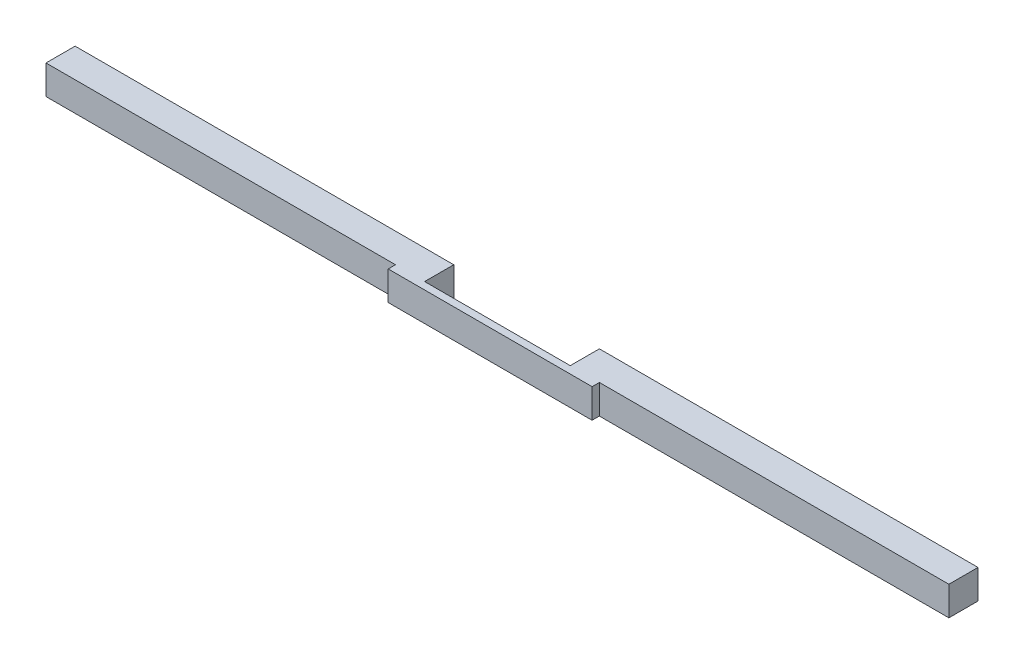
ISO-10303-21;
HEADER;
FILE_DESCRIPTION(('STEP AP214'),'2;1');
FILE_NAME('part.step','',(''),(''),'','','');
FILE_SCHEMA(('AUTOMOTIVE_DESIGN { 1 0 10303 214 1 1 1 1 }'));
ENDSEC;
DATA;
#1=APPLICATION_CONTEXT('core data for automotive mechanical design processes');
#2=APPLICATION_PROTOCOL_DEFINITION('international standard','automotive_design',2000,#1);
#3=PRODUCT_CONTEXT('',#1,'mechanical');
#4=PRODUCT('Part','Part','',(#3));
#5=PRODUCT_RELATED_PRODUCT_CATEGORY('part','',(#4));
#6=PRODUCT_DEFINITION_FORMATION('','',#4);
#7=PRODUCT_DEFINITION_CONTEXT('part definition',#1,'design');
#8=PRODUCT_DEFINITION('design','',#6,#7);
#9=PRODUCT_DEFINITION_SHAPE('','',#8);
#10=(LENGTH_UNIT() NAMED_UNIT(*) SI_UNIT(.MILLI.,.METRE.));
#11=(NAMED_UNIT(*) PLANE_ANGLE_UNIT() SI_UNIT($,.RADIAN.));
#12=(NAMED_UNIT(*) SI_UNIT($,.STERADIAN.) SOLID_ANGLE_UNIT());
#13=UNCERTAINTY_MEASURE_WITH_UNIT(LENGTH_MEASURE(1.E-05),#10,'distance_accuracy_value','');
#14=(GEOMETRIC_REPRESENTATION_CONTEXT(3) GLOBAL_UNCERTAINTY_ASSIGNED_CONTEXT((#13)) GLOBAL_UNIT_ASSIGNED_CONTEXT((#10,
#11,#12)) REPRESENTATION_CONTEXT('',''));
#15=CARTESIAN_POINT('',(0.,0.,0.));
#16=DIRECTION('',(0.,0.,1.));
#17=DIRECTION('',(1.,0.,0.));
#18=AXIS2_PLACEMENT_3D('',#15,#16,#17);
#19=CARTESIAN_POINT('',(0.,25.4,0.));
#20=DIRECTION('',(1.,0.,0.));
#21=DIRECTION('',(0.,0.,-1.));
#22=AXIS2_PLACEMENT_3D('',#19,#20,#21);
#23=PLANE('',#22);
#24=DIRECTION('',(0.,0.,1.));
#25=VECTOR('',#24,1.);
#26=CARTESIAN_POINT('',(0.,0.,0.));
#27=LINE('',#26,#25);
#28=CARTESIAN_POINT('',(0.,0.,-25.4));
#29=VERTEX_POINT('',#28);
#30=CARTESIAN_POINT('',(0.,0.,0.));
#31=VERTEX_POINT('',#30);
#32=EDGE_CURVE('E153',#29,#31,#27,.T.);
#33=ORIENTED_EDGE('',*,*,#32,.T.);
#34=DIRECTION('',(0.,-1.,0.));
#35=VECTOR('',#34,1.);
#36=CARTESIAN_POINT('',(0.,25.4,0.));
#37=LINE('',#36,#35);
#38=CARTESIAN_POINT('',(0.,25.4,0.));
#39=VERTEX_POINT('',#38);
#40=EDGE_CURVE('E11',#39,#31,#37,.T.);
#41=ORIENTED_EDGE('',*,*,#40,.F.);
#42=DIRECTION('',(0.,0.,1.));
#43=VECTOR('',#42,1.);
#44=CARTESIAN_POINT('',(0.,25.4,0.));
#45=LINE('',#44,#43);
#46=CARTESIAN_POINT('',(0.,25.4,-25.4));
#47=VERTEX_POINT('',#46);
#48=EDGE_CURVE('E175',#47,#39,#45,.T.);
#49=ORIENTED_EDGE('',*,*,#48,.F.);
#50=DIRECTION('',(0.,-1.,0.));
#51=VECTOR('',#50,1.);
#52=CARTESIAN_POINT('',(0.,25.4,-25.4));
#53=LINE('',#52,#51);
#54=EDGE_CURVE('E149',#47,#29,#53,.T.);
#55=ORIENTED_EDGE('',*,*,#54,.T.);
#56=EDGE_LOOP('',(#33,#41,#49,#55));
#57=FACE_BOUND('',#56,.T.);
#58=ADVANCED_FACE('F33',(#57),#23,.F.);
#59=CARTESIAN_POINT('',(0.,25.4,0.));
#60=DIRECTION('',(0.,0.,-1.));
#61=DIRECTION('',(-1.,0.,0.));
#62=AXIS2_PLACEMENT_3D('',#59,#60,#61);
#63=PLANE('',#62);
#64=DIRECTION('',(1.,0.,0.));
#65=VECTOR('',#64,1.);
#66=CARTESIAN_POINT('',(0.,0.,0.));
#67=LINE('',#66,#65);
#68=CARTESIAN_POINT('',(304.8,0.,0.));
#69=VERTEX_POINT('',#68);
#70=EDGE_CURVE('E156',#31,#69,#67,.T.);
#71=ORIENTED_EDGE('',*,*,#70,.T.);
#72=DIRECTION('',(0.,-1.,0.));
#73=VECTOR('',#72,1.);
#74=CARTESIAN_POINT('',(304.8,25.4,0.));
#75=LINE('',#74,#73);
#76=CARTESIAN_POINT('',(304.8,25.4,0.));
#77=VERTEX_POINT('',#76);
#78=EDGE_CURVE('E41',#77,#69,#75,.T.);
#79=ORIENTED_EDGE('',*,*,#78,.F.);
#80=DIRECTION('',(1.,0.,0.));
#81=VECTOR('',#80,1.);
#82=CARTESIAN_POINT('',(0.,25.4,0.));
#83=LINE('',#82,#81);
#84=EDGE_CURVE('E104',#39,#77,#83,.T.);
#85=ORIENTED_EDGE('',*,*,#84,.F.);
#86=ORIENTED_EDGE('',*,*,#40,.T.);
#87=EDGE_LOOP('',(#71,#79,#85,#86));
#88=FACE_BOUND('',#87,.T.);
#89=ADVANCED_FACE('F253',(#88),#63,.F.);
#90=CARTESIAN_POINT('',(304.8,25.4,0.));
#91=DIRECTION('',(1.,0.,0.));
#92=DIRECTION('',(0.,0.,-1.));
#93=AXIS2_PLACEMENT_3D('',#90,#91,#92);
#94=PLANE('',#93);
#95=DIRECTION('',(0.,0.,1.));
#96=VECTOR('',#95,1.);
#97=CARTESIAN_POINT('',(304.8,0.,0.));
#98=LINE('',#97,#96);
#99=CARTESIAN_POINT('',(304.8,0.,6.35));
#100=VERTEX_POINT('',#99);
#101=EDGE_CURVE('E158',#69,#100,#98,.T.);
#102=ORIENTED_EDGE('',*,*,#101,.T.);
#103=DIRECTION('',(0.,-1.,0.));
#104=VECTOR('',#103,1.);
#105=CARTESIAN_POINT('',(304.8,25.4,6.35));
#106=LINE('',#105,#104);
#107=CARTESIAN_POINT('',(304.8,25.4,6.35));
#108=VERTEX_POINT('',#107);
#109=EDGE_CURVE('E194',#108,#100,#106,.T.);
#110=ORIENTED_EDGE('',*,*,#109,.F.);
#111=DIRECTION('',(0.,0.,1.));
#112=VECTOR('',#111,1.);
#113=CARTESIAN_POINT('',(304.8,25.4,0.));
#114=LINE('',#113,#112);
#115=EDGE_CURVE('E202',#77,#108,#114,.T.);
#116=ORIENTED_EDGE('',*,*,#115,.F.);
#117=ORIENTED_EDGE('',*,*,#78,.T.);
#118=EDGE_LOOP('',(#102,#110,#116,#117));
#119=FACE_BOUND('',#118,.T.);
#120=ADVANCED_FACE('F200',(#119),#94,.F.);
#121=CARTESIAN_POINT('',(304.8,25.4,6.35));
#122=DIRECTION('',(0.,0.,-1.));
#123=DIRECTION('',(-1.,0.,0.));
#124=AXIS2_PLACEMENT_3D('',#121,#122,#123);
#125=PLANE('',#124);
#126=DIRECTION('',(1.,0.,0.));
#127=VECTOR('',#126,1.);
#128=CARTESIAN_POINT('',(304.8,0.,6.35));
#129=LINE('',#128,#127);
#130=CARTESIAN_POINT('',(482.6,0.,6.35));
#131=VERTEX_POINT('',#130);
#132=EDGE_CURVE('E160',#100,#131,#129,.T.);
#133=ORIENTED_EDGE('',*,*,#132,.T.);
#134=DIRECTION('',(0.,-1.,0.));
#135=VECTOR('',#134,1.);
#136=CARTESIAN_POINT('',(482.6,25.4,6.35));
#137=LINE('',#136,#135);
#138=CARTESIAN_POINT('',(482.6,25.4,6.35));
#139=VERTEX_POINT('',#138);
#140=EDGE_CURVE('E191',#139,#131,#137,.T.);
#141=ORIENTED_EDGE('',*,*,#140,.F.);
#142=DIRECTION('',(1.,0.,0.));
#143=VECTOR('',#142,1.);
#144=CARTESIAN_POINT('',(304.8,25.4,6.35));
#145=LINE('',#144,#143);
#146=EDGE_CURVE('E220',#108,#139,#145,.T.);
#147=ORIENTED_EDGE('',*,*,#146,.F.);
#148=ORIENTED_EDGE('',*,*,#109,.T.);
#149=EDGE_LOOP('',(#133,#141,#147,#148));
#150=FACE_BOUND('',#149,.T.);
#151=ADVANCED_FACE('F211',(#150),#125,.F.);
#152=CARTESIAN_POINT('',(482.6,25.4,0.));
#153=DIRECTION('',(-1.,0.,0.));
#154=DIRECTION('',(0.,0.,1.));
#155=AXIS2_PLACEMENT_3D('',#152,#153,#154);
#156=PLANE('',#155);
#157=DIRECTION('',(0.,0.,-1.));
#158=VECTOR('',#157,1.);
#159=CARTESIAN_POINT('',(482.6,0.,0.));
#160=LINE('',#159,#158);
#161=CARTESIAN_POINT('',(482.6,0.,0.));
#162=VERTEX_POINT('',#161);
#163=EDGE_CURVE('E162',#131,#162,#160,.T.);
#164=ORIENTED_EDGE('',*,*,#163,.T.);
#165=DIRECTION('',(0.,-1.,0.));
#166=VECTOR('',#165,1.);
#167=CARTESIAN_POINT('',(482.6,25.4,0.));
#168=LINE('',#167,#166);
#169=CARTESIAN_POINT('',(482.6,25.4,0.));
#170=VERTEX_POINT('',#169);
#171=EDGE_CURVE('E188',#170,#162,#168,.T.);
#172=ORIENTED_EDGE('',*,*,#171,.F.);
#173=DIRECTION('',(0.,0.,-1.));
#174=VECTOR('',#173,1.);
#175=CARTESIAN_POINT('',(482.6,25.4,0.));
#176=LINE('',#175,#174);
#177=EDGE_CURVE('E217',#139,#170,#176,.T.);
#178=ORIENTED_EDGE('',*,*,#177,.F.);
#179=ORIENTED_EDGE('',*,*,#140,.T.);
#180=EDGE_LOOP('',(#164,#172,#178,#179));
#181=FACE_BOUND('',#180,.T.);
#182=ADVANCED_FACE('F215',(#181),#156,.F.);
#183=CARTESIAN_POINT('',(482.6,25.4,0.));
#184=DIRECTION('',(0.,0.,-1.));
#185=DIRECTION('',(-1.,0.,0.));
#186=AXIS2_PLACEMENT_3D('',#183,#184,#185);
#187=PLANE('',#186);
#188=DIRECTION('',(1.,0.,0.));
#189=VECTOR('',#188,1.);
#190=CARTESIAN_POINT('',(482.6,0.,0.));
#191=LINE('',#190,#189);
#192=CARTESIAN_POINT('',(787.4,0.,0.));
#193=VERTEX_POINT('',#192);
#194=EDGE_CURVE('E164',#162,#193,#191,.T.);
#195=ORIENTED_EDGE('',*,*,#194,.T.);
#196=DIRECTION('',(0.,-1.,0.));
#197=VECTOR('',#196,1.);
#198=CARTESIAN_POINT('',(787.4,25.4,0.));
#199=LINE('',#198,#197);
#200=CARTESIAN_POINT('',(787.4,25.4,0.));
#201=VERTEX_POINT('',#200);
#202=EDGE_CURVE('E185',#201,#193,#199,.T.);
#203=ORIENTED_EDGE('',*,*,#202,.F.);
#204=DIRECTION('',(1.,0.,0.));
#205=VECTOR('',#204,1.);
#206=CARTESIAN_POINT('',(482.6,25.4,0.));
#207=LINE('',#206,#205);
#208=EDGE_CURVE('E219',#170,#201,#207,.T.);
#209=ORIENTED_EDGE('',*,*,#208,.F.);
#210=ORIENTED_EDGE('',*,*,#171,.T.);
#211=EDGE_LOOP('',(#195,#203,#209,#210));
#212=FACE_BOUND('',#211,.T.);
#213=ADVANCED_FACE('F266',(#212),#187,.F.);
#214=CARTESIAN_POINT('',(787.4,25.4,0.));
#215=DIRECTION('',(-1.,0.,0.));
#216=DIRECTION('',(0.,0.,1.));
#217=AXIS2_PLACEMENT_3D('',#214,#215,#216);
#218=PLANE('',#217);
#219=DIRECTION('',(0.,0.,-1.));
#220=VECTOR('',#219,1.);
#221=CARTESIAN_POINT('',(787.4,0.,0.));
#222=LINE('',#221,#220);
#223=CARTESIAN_POINT('',(787.4,0.,-25.4));
#224=VERTEX_POINT('',#223);
#225=EDGE_CURVE('E166',#193,#224,#222,.T.);
#226=ORIENTED_EDGE('',*,*,#225,.T.);
#227=DIRECTION('',(0.,-1.,0.));
#228=VECTOR('',#227,1.);
#229=CARTESIAN_POINT('',(787.4,25.4,-25.4));
#230=LINE('',#229,#228);
#231=CARTESIAN_POINT('',(787.4,25.4,-25.4));
#232=VERTEX_POINT('',#231);
#233=EDGE_CURVE('E182',#232,#224,#230,.T.);
#234=ORIENTED_EDGE('',*,*,#233,.F.);
#235=DIRECTION('',(0.,0.,-1.));
#236=VECTOR('',#235,1.);
#237=CARTESIAN_POINT('',(787.4,25.4,0.));
#238=LINE('',#237,#236);
#239=EDGE_CURVE('E222',#201,#232,#238,.T.);
#240=ORIENTED_EDGE('',*,*,#239,.F.);
#241=ORIENTED_EDGE('',*,*,#202,.T.);
#242=EDGE_LOOP('',(#226,#234,#240,#241));
#243=FACE_BOUND('',#242,.T.);
#244=ADVANCED_FACE('F269',(#243),#218,.F.);
#245=CARTESIAN_POINT('',(457.2,25.4,-25.4));
#246=DIRECTION('',(0.,0.,1.));
#247=DIRECTION('',(1.,0.,0.));
#248=AXIS2_PLACEMENT_3D('',#245,#246,#247);
#249=PLANE('',#248);
#250=DIRECTION('',(-1.,0.,0.));
#251=VECTOR('',#250,1.);
#252=CARTESIAN_POINT('',(457.2,0.,-25.4));
#253=LINE('',#252,#251);
#254=CARTESIAN_POINT('',(457.2,0.,-25.4));
#255=VERTEX_POINT('',#254);
#256=EDGE_CURVE('E168',#224,#255,#253,.T.);
#257=ORIENTED_EDGE('',*,*,#256,.T.);
#258=DIRECTION('',(0.,-1.,0.));
#259=VECTOR('',#258,1.);
#260=CARTESIAN_POINT('',(457.2,25.4,-25.4));
#261=LINE('',#260,#259);
#262=CARTESIAN_POINT('',(457.2,25.4,-25.4));
#263=VERTEX_POINT('',#262);
#264=EDGE_CURVE('E179',#263,#255,#261,.T.);
#265=ORIENTED_EDGE('',*,*,#264,.F.);
#266=DIRECTION('',(-1.,0.,0.));
#267=VECTOR('',#266,1.);
#268=CARTESIAN_POINT('',(457.2,25.4,-25.4));
#269=LINE('',#268,#267);
#270=EDGE_CURVE('E228',#232,#263,#269,.T.);
#271=ORIENTED_EDGE('',*,*,#270,.F.);
#272=ORIENTED_EDGE('',*,*,#233,.T.);
#273=EDGE_LOOP('',(#257,#265,#271,#272));
#274=FACE_BOUND('',#273,.T.);
#275=ADVANCED_FACE('F234',(#274),#249,.F.);
#276=CARTESIAN_POINT('',(457.2,25.4,0.));
#277=DIRECTION('',(1.,0.,0.));
#278=DIRECTION('',(0.,0.,-1.));
#279=AXIS2_PLACEMENT_3D('',#276,#277,#278);
#280=PLANE('',#279);
#281=DIRECTION('',(0.,0.,1.));
#282=VECTOR('',#281,1.);
#283=CARTESIAN_POINT('',(457.2,0.,0.));
#284=LINE('',#283,#282);
#285=CARTESIAN_POINT('',(457.2,0.,0.));
#286=VERTEX_POINT('',#285);
#287=EDGE_CURVE('E170',#255,#286,#284,.T.);
#288=ORIENTED_EDGE('',*,*,#287,.T.);
#289=DIRECTION('',(0.,-1.,0.));
#290=VECTOR('',#289,1.);
#291=CARTESIAN_POINT('',(457.2,25.4,0.));
#292=LINE('',#291,#290);
#293=CARTESIAN_POINT('',(457.2,25.4,0.));
#294=VERTEX_POINT('',#293);
#295=EDGE_CURVE('E144',#294,#286,#292,.T.);
#296=ORIENTED_EDGE('',*,*,#295,.F.);
#297=DIRECTION('',(0.,0.,1.));
#298=VECTOR('',#297,1.);
#299=CARTESIAN_POINT('',(457.2,25.4,0.));
#300=LINE('',#299,#298);
#301=EDGE_CURVE('E135',#263,#294,#300,.T.);
#302=ORIENTED_EDGE('',*,*,#301,.F.);
#303=ORIENTED_EDGE('',*,*,#264,.T.);
#304=EDGE_LOOP('',(#288,#296,#302,#303));
#305=FACE_BOUND('',#304,.T.);
#306=ADVANCED_FACE('F238',(#305),#280,.F.);
#307=CARTESIAN_POINT('',(330.2,25.4,0.));
#308=DIRECTION('',(0.,0.,1.));
#309=DIRECTION('',(1.,0.,0.));
#310=AXIS2_PLACEMENT_3D('',#307,#308,#309);
#311=PLANE('',#310);
#312=DIRECTION('',(-1.,0.,0.));
#313=VECTOR('',#312,1.);
#314=CARTESIAN_POINT('',(330.2,0.,0.));
#315=LINE('',#314,#313);
#316=CARTESIAN_POINT('',(330.2,0.,0.));
#317=VERTEX_POINT('',#316);
#318=EDGE_CURVE('E143',#286,#317,#315,.T.);
#319=ORIENTED_EDGE('',*,*,#318,.T.);
#320=DIRECTION('',(0.,-1.,0.));
#321=VECTOR('',#320,1.);
#322=CARTESIAN_POINT('',(330.2,25.4,0.));
#323=LINE('',#322,#321);
#324=CARTESIAN_POINT('',(330.2,25.4,0.));
#325=VERTEX_POINT('',#324);
#326=EDGE_CURVE('E140',#325,#317,#323,.T.);
#327=ORIENTED_EDGE('',*,*,#326,.F.);
#328=DIRECTION('',(-1.,0.,0.));
#329=VECTOR('',#328,1.);
#330=CARTESIAN_POINT('',(330.2,25.4,0.));
#331=LINE('',#330,#329);
#332=EDGE_CURVE('E129',#294,#325,#331,.T.);
#333=ORIENTED_EDGE('',*,*,#332,.F.);
#334=ORIENTED_EDGE('',*,*,#295,.T.);
#335=EDGE_LOOP('',(#319,#327,#333,#334));
#336=FACE_BOUND('',#335,.T.);
#337=ADVANCED_FACE('F141',(#336),#311,.F.);
#338=CARTESIAN_POINT('',(330.2,25.4,0.));
#339=DIRECTION('',(-1.,0.,0.));
#340=DIRECTION('',(0.,0.,1.));
#341=AXIS2_PLACEMENT_3D('',#338,#339,#340);
#342=PLANE('',#341);
#343=DIRECTION('',(0.,0.,-1.));
#344=VECTOR('',#343,1.);
#345=CARTESIAN_POINT('',(330.2,0.,0.));
#346=LINE('',#345,#344);
#347=CARTESIAN_POINT('',(330.2,0.,-25.4));
#348=VERTEX_POINT('',#347);
#349=EDGE_CURVE('E90',#317,#348,#346,.T.);
#350=ORIENTED_EDGE('',*,*,#349,.T.);
#351=DIRECTION('',(0.,-1.,0.));
#352=VECTOR('',#351,1.);
#353=CARTESIAN_POINT('',(330.2,25.4,-25.4));
#354=LINE('',#353,#352);
#355=CARTESIAN_POINT('',(330.2,25.4,-25.4));
#356=VERTEX_POINT('',#355);
#357=EDGE_CURVE('E145',#356,#348,#354,.T.);
#358=ORIENTED_EDGE('',*,*,#357,.F.);
#359=DIRECTION('',(0.,0.,-1.));
#360=VECTOR('',#359,1.);
#361=CARTESIAN_POINT('',(330.2,25.4,0.));
#362=LINE('',#361,#360);
#363=EDGE_CURVE('E133',#325,#356,#362,.T.);
#364=ORIENTED_EDGE('',*,*,#363,.F.);
#365=ORIENTED_EDGE('',*,*,#326,.T.);
#366=EDGE_LOOP('',(#350,#358,#364,#365));
#367=FACE_BOUND('',#366,.T.);
#368=ADVANCED_FACE('F147',(#367),#342,.F.);
#369=CARTESIAN_POINT('',(0.,25.4,-25.4));
#370=DIRECTION('',(0.,0.,1.));
#371=DIRECTION('',(1.,0.,0.));
#372=AXIS2_PLACEMENT_3D('',#369,#370,#371);
#373=PLANE('',#372);
#374=DIRECTION('',(-1.,0.,0.));
#375=VECTOR('',#374,1.);
#376=CARTESIAN_POINT('',(0.,0.,-25.4));
#377=LINE('',#376,#375);
#378=EDGE_CURVE('E96',#348,#29,#377,.T.);
#379=ORIENTED_EDGE('',*,*,#378,.T.);
#380=ORIENTED_EDGE('',*,*,#54,.F.);
#381=DIRECTION('',(-1.,0.,0.));
#382=VECTOR('',#381,1.);
#383=CARTESIAN_POINT('',(0.,25.4,-25.4));
#384=LINE('',#383,#382);
#385=EDGE_CURVE('E49',#356,#47,#384,.T.);
#386=ORIENTED_EDGE('',*,*,#385,.F.);
#387=ORIENTED_EDGE('',*,*,#357,.T.);
#388=EDGE_LOOP('',(#379,#380,#386,#387));
#389=FACE_BOUND('',#388,.T.);
#390=ADVANCED_FACE('F242',(#389),#373,.F.);
#391=CARTESIAN_POINT('',(0.,25.4,0.));
#392=DIRECTION('',(0.,-1.,0.));
#393=DIRECTION('',(0.,0.,-1.));
#394=AXIS2_PLACEMENT_3D('',#391,#392,#393);
#395=PLANE('',#394);
#396=ORIENTED_EDGE('',*,*,#48,.T.);
#397=ORIENTED_EDGE('',*,*,#84,.T.);
#398=ORIENTED_EDGE('',*,*,#115,.T.);
#399=ORIENTED_EDGE('',*,*,#146,.T.);
#400=ORIENTED_EDGE('',*,*,#177,.T.);
#401=ORIENTED_EDGE('',*,*,#208,.T.);
#402=ORIENTED_EDGE('',*,*,#239,.T.);
#403=ORIENTED_EDGE('',*,*,#270,.T.);
#404=ORIENTED_EDGE('',*,*,#301,.T.);
#405=ORIENTED_EDGE('',*,*,#332,.T.);
#406=ORIENTED_EDGE('',*,*,#363,.T.);
#407=ORIENTED_EDGE('',*,*,#385,.T.);
#408=EDGE_LOOP('',(#396,#397,#398,#399,#400,#401,#402,#403,#404,#405,#406,#407));
#409=FACE_BOUND('',#408,.T.);
#410=ADVANCED_FACE('F131',(#409),#395,.F.);
#411=CARTESIAN_POINT('',(0.,0.,0.));
#412=DIRECTION('',(0.,-1.,0.));
#413=DIRECTION('',(0.,0.,-1.));
#414=AXIS2_PLACEMENT_3D('',#411,#412,#413);
#415=PLANE('',#414);
#416=ORIENTED_EDGE('',*,*,#32,.F.);
#417=ORIENTED_EDGE('',*,*,#378,.F.);
#418=ORIENTED_EDGE('',*,*,#349,.F.);
#419=ORIENTED_EDGE('',*,*,#318,.F.);
#420=ORIENTED_EDGE('',*,*,#287,.F.);
#421=ORIENTED_EDGE('',*,*,#256,.F.);
#422=ORIENTED_EDGE('',*,*,#225,.F.);
#423=ORIENTED_EDGE('',*,*,#194,.F.);
#424=ORIENTED_EDGE('',*,*,#163,.F.);
#425=ORIENTED_EDGE('',*,*,#132,.F.);
#426=ORIENTED_EDGE('',*,*,#101,.F.);
#427=ORIENTED_EDGE('',*,*,#70,.F.);
#428=EDGE_LOOP('',(#416,#417,#418,#419,#420,#421,#422,#423,#424,#425,#426,#427));
#429=FACE_BOUND('',#428,.T.);
#430=ADVANCED_FACE('F206',(#429),#415,.T.);
#431=CLOSED_SHELL('',(#58,#89,#120,#151,#182,#213,#244,#275,#306,#337,#368,#390,#410,#430));
#432=MANIFOLD_SOLID_BREP('B2',#431);
#433=ADVANCED_BREP_SHAPE_REPRESENTATION('',(#18,#432),#14);
#434=SHAPE_DEFINITION_REPRESENTATION(#9,#433);
ENDSEC;
END-ISO-10303-21;
